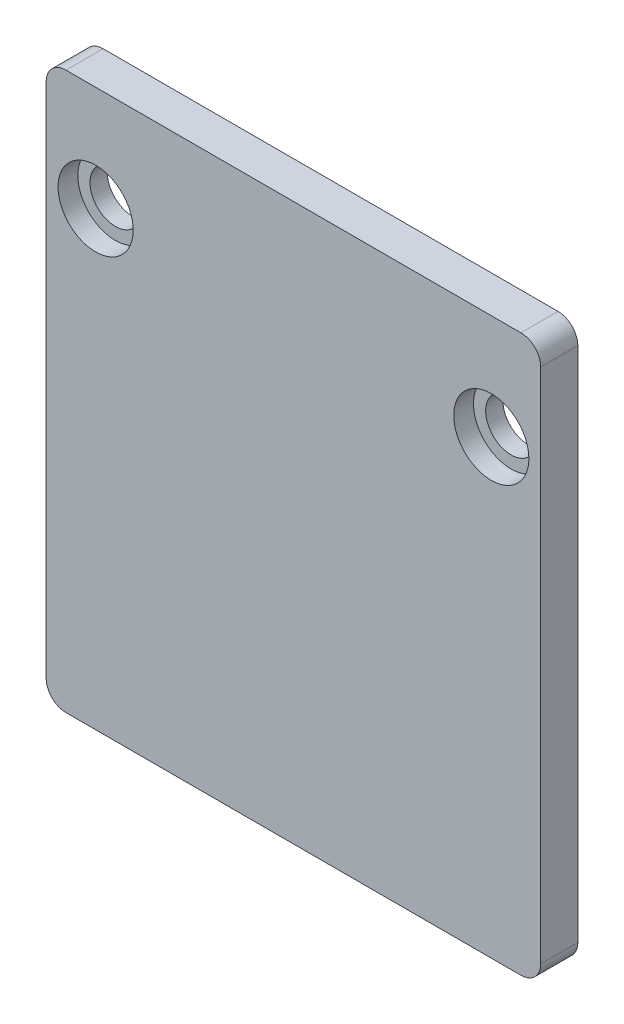
ISO-10303-21;
HEADER;
FILE_DESCRIPTION(('STEP AP214'),'2;1');
FILE_NAME('part.step','',(''),(''),'','','');
FILE_SCHEMA(('AUTOMOTIVE_DESIGN { 1 0 10303 214 1 1 1 1 }'));
ENDSEC;
DATA;
#1=APPLICATION_CONTEXT('core data for automotive mechanical design processes');
#2=APPLICATION_PROTOCOL_DEFINITION('international standard','automotive_design',2000,#1);
#3=PRODUCT_CONTEXT('',#1,'mechanical');
#4=PRODUCT('Part','Part','',(#3));
#5=PRODUCT_RELATED_PRODUCT_CATEGORY('part','',(#4));
#6=PRODUCT_DEFINITION_FORMATION('','',#4);
#7=PRODUCT_DEFINITION_CONTEXT('part definition',#1,'design');
#8=PRODUCT_DEFINITION('design','',#6,#7);
#9=PRODUCT_DEFINITION_SHAPE('','',#8);
#10=(LENGTH_UNIT() NAMED_UNIT(*) SI_UNIT(.MILLI.,.METRE.));
#11=(NAMED_UNIT(*) PLANE_ANGLE_UNIT() SI_UNIT($,.RADIAN.));
#12=(NAMED_UNIT(*) SI_UNIT($,.STERADIAN.) SOLID_ANGLE_UNIT());
#13=UNCERTAINTY_MEASURE_WITH_UNIT(LENGTH_MEASURE(1.E-05),#10,'distance_accuracy_value','');
#14=(GEOMETRIC_REPRESENTATION_CONTEXT(3) GLOBAL_UNCERTAINTY_ASSIGNED_CONTEXT((#13)) GLOBAL_UNIT_ASSIGNED_CONTEXT((#10,
#11,#12)) REPRESENTATION_CONTEXT('',''));
#15=CARTESIAN_POINT('',(0.,0.,0.));
#16=DIRECTION('',(0.,0.,1.));
#17=DIRECTION('',(1.,0.,0.));
#18=AXIS2_PLACEMENT_3D('',#15,#16,#17);
#19=CARTESIAN_POINT('',(0.,0.,4.7625));
#20=DIRECTION('',(0.,0.,-1.));
#21=DIRECTION('',(-1.,0.,0.));
#22=AXIS2_PLACEMENT_3D('',#19,#20,#21);
#23=PLANE('',#22);
#24=CARTESIAN_POINT('',(57.15,57.9501,4.7625));
#25=DIRECTION('',(0.,0.,1.));
#26=DIRECTION('',(1.,0.,0.));
#27=AXIS2_PLACEMENT_3D('',#24,#25,#26);
#28=CIRCLE('',#27,4.826);
#29=CARTESIAN_POINT('',(61.976,57.9501,4.7625));
#30=VERTEX_POINT('',#29);
#31=EDGE_CURVE('E186',#30,#30,#28,.T.);
#32=ORIENTED_EDGE('',*,*,#31,.F.);
#33=EDGE_LOOP('',(#32));
#34=FACE_BOUND('',#33,.T.);
#35=DIRECTION('',(0.,-1.,0.));
#36=VECTOR('',#35,1.);
#37=CARTESIAN_POINT('',(0.,0.,4.7625));
#38=LINE('',#37,#36);
#39=CARTESIAN_POINT('',(0.,68.8975,4.7625));
#40=VERTEX_POINT('',#39);
#41=CARTESIAN_POINT('',(0.,2.54,4.7625));
#42=VERTEX_POINT('',#41);
#43=EDGE_CURVE('E138',#40,#42,#38,.T.);
#44=ORIENTED_EDGE('',*,*,#43,.T.);
#45=CARTESIAN_POINT('',(2.54,2.54,4.7625));
#46=DIRECTION('',(0.,0.,-1.));
#47=DIRECTION('',(-1.,0.,0.));
#48=AXIS2_PLACEMENT_3D('',#45,#46,#47);
#49=CIRCLE('',#48,2.54);
#50=CARTESIAN_POINT('',(2.54,0.,4.7625));
#51=VERTEX_POINT('',#50);
#52=EDGE_CURVE('E153',#42,#51,#49,.F.);
#53=ORIENTED_EDGE('',*,*,#52,.T.);
#54=DIRECTION('',(1.,0.,0.));
#55=VECTOR('',#54,1.);
#56=CARTESIAN_POINT('',(0.,0.,4.7625));
#57=LINE('',#56,#55);
#58=CARTESIAN_POINT('',(60.96,0.,4.7625));
#59=VERTEX_POINT('',#58);
#60=EDGE_CURVE('E121',#51,#59,#57,.T.);
#61=ORIENTED_EDGE('',*,*,#60,.T.);
#62=CARTESIAN_POINT('',(60.96,2.54,4.7625));
#63=DIRECTION('',(0.,0.,-1.));
#64=DIRECTION('',(-1.,0.,0.));
#65=AXIS2_PLACEMENT_3D('',#62,#63,#64);
#66=CIRCLE('',#65,2.54);
#67=CARTESIAN_POINT('',(63.5,2.54,4.7625));
#68=VERTEX_POINT('',#67);
#69=EDGE_CURVE('E151',#59,#68,#66,.F.);
#70=ORIENTED_EDGE('',*,*,#69,.T.);
#71=DIRECTION('',(0.,1.,0.));
#72=VECTOR('',#71,1.);
#73=CARTESIAN_POINT('',(63.5,0.,4.7625));
#74=LINE('',#73,#72);
#75=CARTESIAN_POINT('',(63.5,68.8975,4.7625));
#76=VERTEX_POINT('',#75);
#77=EDGE_CURVE('E164',#68,#76,#74,.T.);
#78=ORIENTED_EDGE('',*,*,#77,.T.);
#79=CARTESIAN_POINT('',(60.96,68.8975,4.7625));
#80=DIRECTION('',(0.,0.,-1.));
#81=DIRECTION('',(-1.,0.,0.));
#82=AXIS2_PLACEMENT_3D('',#79,#80,#81);
#83=CIRCLE('',#82,2.54);
#84=CARTESIAN_POINT('',(60.96,71.4375,4.7625));
#85=VERTEX_POINT('',#84);
#86=EDGE_CURVE('E56',#76,#85,#83,.F.);
#87=ORIENTED_EDGE('',*,*,#86,.T.);
#88=DIRECTION('',(-1.,0.,0.));
#89=VECTOR('',#88,1.);
#90=CARTESIAN_POINT('',(0.,71.4375,4.7625));
#91=LINE('',#90,#89);
#92=CARTESIAN_POINT('',(2.54,71.4375,4.7625));
#93=VERTEX_POINT('',#92);
#94=EDGE_CURVE('E139',#85,#93,#91,.T.);
#95=ORIENTED_EDGE('',*,*,#94,.T.);
#96=CARTESIAN_POINT('',(2.54,68.8975,4.7625));
#97=DIRECTION('',(0.,0.,-1.));
#98=DIRECTION('',(-1.,0.,0.));
#99=AXIS2_PLACEMENT_3D('',#96,#97,#98);
#100=CIRCLE('',#99,2.54);
#101=EDGE_CURVE('E148',#93,#40,#100,.F.);
#102=ORIENTED_EDGE('',*,*,#101,.T.);
#103=EDGE_LOOP('',(#44,#53,#61,#70,#78,#87,#95,#102));
#104=FACE_BOUND('',#103,.T.);
#105=CARTESIAN_POINT('',(6.35,57.9501,4.7625));
#106=DIRECTION('',(0.,0.,1.));
#107=DIRECTION('',(1.,0.,0.));
#108=AXIS2_PLACEMENT_3D('',#105,#106,#107);
#109=CIRCLE('',#108,4.826);
#110=CARTESIAN_POINT('',(11.176,57.9501,4.7625));
#111=VERTEX_POINT('',#110);
#112=EDGE_CURVE('E198',#111,#111,#109,.T.);
#113=ORIENTED_EDGE('',*,*,#112,.F.);
#114=EDGE_LOOP('',(#113));
#115=FACE_BOUND('',#114,.T.);
#116=ADVANCED_FACE('F35',(#34,#104,#115),#23,.F.);
#117=CARTESIAN_POINT('',(0.,0.,4.7625));
#118=DIRECTION('',(1.,0.,0.));
#119=DIRECTION('',(0.,0.,-1.));
#120=AXIS2_PLACEMENT_3D('',#117,#118,#119);
#121=PLANE('',#120);
#122=DIRECTION('',(0.,-1.,0.));
#123=VECTOR('',#122,1.);
#124=CARTESIAN_POINT('',(0.,0.,0.));
#125=LINE('',#124,#123);
#126=CARTESIAN_POINT('',(0.,68.8975,0.));
#127=VERTEX_POINT('',#126);
#128=CARTESIAN_POINT('',(0.,2.54,0.));
#129=VERTEX_POINT('',#128);
#130=EDGE_CURVE('E128',#127,#129,#125,.T.);
#131=ORIENTED_EDGE('',*,*,#130,.T.);
#132=DIRECTION('',(0.,0.,-1.));
#133=VECTOR('',#132,1.);
#134=CARTESIAN_POINT('',(0.,2.54,4.7625));
#135=LINE('',#134,#133);
#136=EDGE_CURVE('E106',#129,#42,#135,.F.);
#137=ORIENTED_EDGE('',*,*,#136,.T.);
#138=ORIENTED_EDGE('',*,*,#43,.F.);
#139=DIRECTION('',(0.,0.,-1.));
#140=VECTOR('',#139,1.);
#141=CARTESIAN_POINT('',(0.,68.8975,4.7625));
#142=LINE('',#141,#140);
#143=EDGE_CURVE('E111',#40,#127,#142,.T.);
#144=ORIENTED_EDGE('',*,*,#143,.T.);
#145=EDGE_LOOP('',(#131,#137,#138,#144));
#146=FACE_BOUND('',#145,.T.);
#147=ADVANCED_FACE('F205',(#146),#121,.F.);
#148=CARTESIAN_POINT('',(0.,0.,4.7625));
#149=DIRECTION('',(0.,1.,0.));
#150=DIRECTION('',(0.,0.,1.));
#151=AXIS2_PLACEMENT_3D('',#148,#149,#150);
#152=PLANE('',#151);
#153=ORIENTED_EDGE('',*,*,#60,.F.);
#154=DIRECTION('',(0.,0.,-1.));
#155=VECTOR('',#154,1.);
#156=CARTESIAN_POINT('',(2.54,0.,4.7625));
#157=LINE('',#156,#155);
#158=CARTESIAN_POINT('',(2.54,0.,0.));
#159=VERTEX_POINT('',#158);
#160=EDGE_CURVE('E105',#51,#159,#157,.T.);
#161=ORIENTED_EDGE('',*,*,#160,.T.);
#162=DIRECTION('',(1.,0.,0.));
#163=VECTOR('',#162,1.);
#164=CARTESIAN_POINT('',(0.,0.,0.));
#165=LINE('',#164,#163);
#166=CARTESIAN_POINT('',(60.96,0.,0.));
#167=VERTEX_POINT('',#166);
#168=EDGE_CURVE('E118',#159,#167,#165,.T.);
#169=ORIENTED_EDGE('',*,*,#168,.T.);
#170=DIRECTION('',(0.,0.,-1.));
#171=VECTOR('',#170,1.);
#172=CARTESIAN_POINT('',(60.96,0.,4.7625));
#173=LINE('',#172,#171);
#174=EDGE_CURVE('E123',#167,#59,#173,.F.);
#175=ORIENTED_EDGE('',*,*,#174,.T.);
#176=EDGE_LOOP('',(#153,#161,#169,#175));
#177=FACE_BOUND('',#176,.T.);
#178=ADVANCED_FACE('F117',(#177),#152,.F.);
#179=CARTESIAN_POINT('',(63.5,0.,4.7625));
#180=DIRECTION('',(-1.,0.,0.));
#181=DIRECTION('',(0.,0.,1.));
#182=AXIS2_PLACEMENT_3D('',#179,#180,#181);
#183=PLANE('',#182);
#184=ORIENTED_EDGE('',*,*,#77,.F.);
#185=DIRECTION('',(0.,0.,-1.));
#186=VECTOR('',#185,1.);
#187=CARTESIAN_POINT('',(63.5,2.54,4.7625));
#188=LINE('',#187,#186);
#189=CARTESIAN_POINT('',(63.5,2.54,0.));
#190=VERTEX_POINT('',#189);
#191=EDGE_CURVE('E157',#68,#190,#188,.T.);
#192=ORIENTED_EDGE('',*,*,#191,.T.);
#193=DIRECTION('',(0.,1.,0.));
#194=VECTOR('',#193,1.);
#195=CARTESIAN_POINT('',(63.5,0.,0.));
#196=LINE('',#195,#194);
#197=CARTESIAN_POINT('',(63.5,68.8975,0.));
#198=VERTEX_POINT('',#197);
#199=EDGE_CURVE('E127',#190,#198,#196,.T.);
#200=ORIENTED_EDGE('',*,*,#199,.T.);
#201=DIRECTION('',(0.,0.,-1.));
#202=VECTOR('',#201,1.);
#203=CARTESIAN_POINT('',(63.5,68.8975,4.7625));
#204=LINE('',#203,#202);
#205=EDGE_CURVE('E155',#198,#76,#204,.F.);
#206=ORIENTED_EDGE('',*,*,#205,.T.);
#207=EDGE_LOOP('',(#184,#192,#200,#206));
#208=FACE_BOUND('',#207,.T.);
#209=ADVANCED_FACE('F162',(#208),#183,.F.);
#210=CARTESIAN_POINT('',(0.,71.4375,4.7625));
#211=DIRECTION('',(0.,-1.,0.));
#212=DIRECTION('',(0.,0.,-1.));
#213=AXIS2_PLACEMENT_3D('',#210,#211,#212);
#214=PLANE('',#213);
#215=ORIENTED_EDGE('',*,*,#94,.F.);
#216=DIRECTION('',(0.,0.,-1.));
#217=VECTOR('',#216,1.);
#218=CARTESIAN_POINT('',(60.96,71.4375,4.7625));
#219=LINE('',#218,#217);
#220=CARTESIAN_POINT('',(60.96,71.4375,0.));
#221=VERTEX_POINT('',#220);
#222=EDGE_CURVE('E11',#85,#221,#219,.T.);
#223=ORIENTED_EDGE('',*,*,#222,.T.);
#224=DIRECTION('',(-1.,0.,0.));
#225=VECTOR('',#224,1.);
#226=CARTESIAN_POINT('',(0.,71.4375,0.));
#227=LINE('',#226,#225);
#228=CARTESIAN_POINT('',(2.54,71.4375,0.));
#229=VERTEX_POINT('',#228);
#230=EDGE_CURVE('E131',#221,#229,#227,.T.);
#231=ORIENTED_EDGE('',*,*,#230,.T.);
#232=DIRECTION('',(0.,0.,-1.));
#233=VECTOR('',#232,1.);
#234=CARTESIAN_POINT('',(2.54,71.4375,4.7625));
#235=LINE('',#234,#233);
#236=EDGE_CURVE('E43',#229,#93,#235,.F.);
#237=ORIENTED_EDGE('',*,*,#236,.T.);
#238=EDGE_LOOP('',(#215,#223,#231,#237));
#239=FACE_BOUND('',#238,.T.);
#240=ADVANCED_FACE('F171',(#239),#214,.F.);
#241=CARTESIAN_POINT('',(0.,0.,0.));
#242=DIRECTION('',(0.,0.,-1.));
#243=DIRECTION('',(-1.,0.,0.));
#244=AXIS2_PLACEMENT_3D('',#241,#242,#243);
#245=PLANE('',#244);
#246=CARTESIAN_POINT('',(6.35,57.9501,0.));
#247=DIRECTION('',(0.,0.,1.));
#248=DIRECTION('',(1.,0.,0.));
#249=AXIS2_PLACEMENT_3D('',#246,#247,#248);
#250=CIRCLE('',#249,3.2639);
#251=CARTESIAN_POINT('',(9.6139,57.9501,0.));
#252=VERTEX_POINT('',#251);
#253=EDGE_CURVE('E189',#252,#252,#250,.T.);
#254=ORIENTED_EDGE('',*,*,#253,.T.);
#255=EDGE_LOOP('',(#254));
#256=FACE_BOUND('',#255,.T.);
#257=CARTESIAN_POINT('',(57.15,57.9501,0.));
#258=DIRECTION('',(0.,0.,1.));
#259=DIRECTION('',(1.,0.,0.));
#260=AXIS2_PLACEMENT_3D('',#257,#258,#259);
#261=CIRCLE('',#260,3.2639);
#262=CARTESIAN_POINT('',(60.4139,57.9501,0.));
#263=VERTEX_POINT('',#262);
#264=EDGE_CURVE('E133',#263,#263,#261,.T.);
#265=ORIENTED_EDGE('',*,*,#264,.T.);
#266=EDGE_LOOP('',(#265));
#267=FACE_BOUND('',#266,.T.);
#268=ORIENTED_EDGE('',*,*,#168,.F.);
#269=CARTESIAN_POINT('',(2.54,2.54,0.));
#270=DIRECTION('',(0.,0.,-1.));
#271=DIRECTION('',(-1.,0.,0.));
#272=AXIS2_PLACEMENT_3D('',#269,#270,#271);
#273=CIRCLE('',#272,2.54);
#274=EDGE_CURVE('E101',#159,#129,#273,.T.);
#275=ORIENTED_EDGE('',*,*,#274,.T.);
#276=ORIENTED_EDGE('',*,*,#130,.F.);
#277=CARTESIAN_POINT('',(2.54,68.8975,0.));
#278=DIRECTION('',(0.,0.,-1.));
#279=DIRECTION('',(-1.,0.,0.));
#280=AXIS2_PLACEMENT_3D('',#277,#278,#279);
#281=CIRCLE('',#280,2.54);
#282=EDGE_CURVE('E122',#127,#229,#281,.T.);
#283=ORIENTED_EDGE('',*,*,#282,.T.);
#284=ORIENTED_EDGE('',*,*,#230,.F.);
#285=CARTESIAN_POINT('',(60.96,68.8975,0.));
#286=DIRECTION('',(0.,0.,-1.));
#287=DIRECTION('',(-1.,0.,0.));
#288=AXIS2_PLACEMENT_3D('',#285,#286,#287);
#289=CIRCLE('',#288,2.54);
#290=EDGE_CURVE('E142',#221,#198,#289,.T.);
#291=ORIENTED_EDGE('',*,*,#290,.T.);
#292=ORIENTED_EDGE('',*,*,#199,.F.);
#293=CARTESIAN_POINT('',(60.96,2.54,0.));
#294=DIRECTION('',(0.,0.,-1.));
#295=DIRECTION('',(-1.,0.,0.));
#296=AXIS2_PLACEMENT_3D('',#293,#294,#295);
#297=CIRCLE('',#296,2.54);
#298=EDGE_CURVE('E112',#190,#167,#297,.T.);
#299=ORIENTED_EDGE('',*,*,#298,.T.);
#300=EDGE_LOOP('',(#268,#275,#276,#283,#284,#291,#292,#299));
#301=FACE_BOUND('',#300,.T.);
#302=ADVANCED_FACE('F125',(#256,#267,#301),#245,.T.);
#303=CARTESIAN_POINT('',(57.15,57.9501,4.7625));
#304=DIRECTION('',(0.,0.,1.));
#305=DIRECTION('',(1.,0.,0.));
#306=AXIS2_PLACEMENT_3D('',#303,#304,#305);
#307=CYLINDRICAL_SURFACE('',#306,3.2639);
#308=ORIENTED_EDGE('',*,*,#264,.F.);
#309=EDGE_LOOP('',(#308));
#310=FACE_BOUND('',#309,.T.);
#311=CARTESIAN_POINT('',(57.15,57.9501,2.2225));
#312=DIRECTION('',(0.,0.,1.));
#313=DIRECTION('',(1.,0.,0.));
#314=AXIS2_PLACEMENT_3D('',#311,#312,#313);
#315=CIRCLE('',#314,3.2639);
#316=CARTESIAN_POINT('',(60.4139,57.9501,2.2225));
#317=VERTEX_POINT('',#316);
#318=EDGE_CURVE('E180',#317,#317,#315,.T.);
#319=ORIENTED_EDGE('',*,*,#318,.T.);
#320=EDGE_LOOP('',(#319));
#321=FACE_BOUND('',#320,.T.);
#322=ADVANCED_FACE('F217',(#310,#321),#307,.F.);
#323=CARTESIAN_POINT('',(60.4139,57.9501,2.2225));
#324=DIRECTION('',(0.,0.,-1.));
#325=DIRECTION('',(-1.,0.,0.));
#326=AXIS2_PLACEMENT_3D('',#323,#324,#325);
#327=PLANE('',#326);
#328=ORIENTED_EDGE('',*,*,#318,.F.);
#329=EDGE_LOOP('',(#328));
#330=FACE_BOUND('',#329,.T.);
#331=CARTESIAN_POINT('',(57.15,57.9501,2.2225));
#332=DIRECTION('',(0.,0.,1.));
#333=DIRECTION('',(1.,0.,0.));
#334=AXIS2_PLACEMENT_3D('',#331,#332,#333);
#335=CIRCLE('',#334,4.826);
#336=CARTESIAN_POINT('',(61.976,57.9501,2.2225));
#337=VERTEX_POINT('',#336);
#338=EDGE_CURVE('E183',#337,#337,#335,.T.);
#339=ORIENTED_EDGE('',*,*,#338,.T.);
#340=EDGE_LOOP('',(#339));
#341=FACE_BOUND('',#340,.T.);
#342=ADVANCED_FACE('F292',(#330,#341),#327,.F.);
#343=CARTESIAN_POINT('',(57.15,57.9501,4.7625));
#344=DIRECTION('',(0.,0.,1.));
#345=DIRECTION('',(1.,0.,0.));
#346=AXIS2_PLACEMENT_3D('',#343,#344,#345);
#347=CYLINDRICAL_SURFACE('',#346,4.826);
#348=ORIENTED_EDGE('',*,*,#338,.F.);
#349=EDGE_LOOP('',(#348));
#350=FACE_BOUND('',#349,.T.);
#351=ORIENTED_EDGE('',*,*,#31,.T.);
#352=EDGE_LOOP('',(#351));
#353=FACE_BOUND('',#352,.T.);
#354=ADVANCED_FACE('F284',(#350,#353),#347,.F.);
#355=CARTESIAN_POINT('',(6.35,57.9501,4.7625));
#356=DIRECTION('',(0.,0.,1.));
#357=DIRECTION('',(1.,0.,0.));
#358=AXIS2_PLACEMENT_3D('',#355,#356,#357);
#359=CYLINDRICAL_SURFACE('',#358,3.2639);
#360=ORIENTED_EDGE('',*,*,#253,.F.);
#361=EDGE_LOOP('',(#360));
#362=FACE_BOUND('',#361,.T.);
#363=CARTESIAN_POINT('',(6.35,57.9501,2.2225));
#364=DIRECTION('',(0.,0.,1.));
#365=DIRECTION('',(1.,0.,0.));
#366=AXIS2_PLACEMENT_3D('',#363,#364,#365);
#367=CIRCLE('',#366,3.2639);
#368=CARTESIAN_POINT('',(9.6139,57.9501,2.2225));
#369=VERTEX_POINT('',#368);
#370=EDGE_CURVE('E192',#369,#369,#367,.T.);
#371=ORIENTED_EDGE('',*,*,#370,.T.);
#372=EDGE_LOOP('',(#371));
#373=FACE_BOUND('',#372,.T.);
#374=ADVANCED_FACE('F276',(#362,#373),#359,.F.);
#375=CARTESIAN_POINT('',(9.6139,57.9501,2.2225));
#376=DIRECTION('',(0.,0.,-1.));
#377=DIRECTION('',(-1.,0.,0.));
#378=AXIS2_PLACEMENT_3D('',#375,#376,#377);
#379=PLANE('',#378);
#380=ORIENTED_EDGE('',*,*,#370,.F.);
#381=EDGE_LOOP('',(#380));
#382=FACE_BOUND('',#381,.T.);
#383=CARTESIAN_POINT('',(6.35,57.9501,2.2225));
#384=DIRECTION('',(0.,0.,1.));
#385=DIRECTION('',(1.,0.,0.));
#386=AXIS2_PLACEMENT_3D('',#383,#384,#385);
#387=CIRCLE('',#386,4.826);
#388=CARTESIAN_POINT('',(11.176,57.9501,2.2225));
#389=VERTEX_POINT('',#388);
#390=EDGE_CURVE('E195',#389,#389,#387,.T.);
#391=ORIENTED_EDGE('',*,*,#390,.T.);
#392=EDGE_LOOP('',(#391));
#393=FACE_BOUND('',#392,.T.);
#394=ADVANCED_FACE('F268',(#382,#393),#379,.F.);
#395=CARTESIAN_POINT('',(6.35,57.9501,4.7625));
#396=DIRECTION('',(0.,0.,1.));
#397=DIRECTION('',(1.,0.,0.));
#398=AXIS2_PLACEMENT_3D('',#395,#396,#397);
#399=CYLINDRICAL_SURFACE('',#398,4.826);
#400=ORIENTED_EDGE('',*,*,#390,.F.);
#401=EDGE_LOOP('',(#400));
#402=FACE_BOUND('',#401,.T.);
#403=ORIENTED_EDGE('',*,*,#112,.T.);
#404=EDGE_LOOP('',(#403));
#405=FACE_BOUND('',#404,.T.);
#406=ADVANCED_FACE('F202',(#402,#405),#399,.F.);
#407=CARTESIAN_POINT('',(2.54,2.54,4.7625));
#408=DIRECTION('',(0.,0.,-1.));
#409=DIRECTION('',(-1.,0.,0.));
#410=AXIS2_PLACEMENT_3D('',#407,#408,#409);
#411=CYLINDRICAL_SURFACE('',#410,2.54);
#412=ORIENTED_EDGE('',*,*,#52,.F.);
#413=ORIENTED_EDGE('',*,*,#136,.F.);
#414=ORIENTED_EDGE('',*,*,#274,.F.);
#415=ORIENTED_EDGE('',*,*,#160,.F.);
#416=EDGE_LOOP('',(#412,#413,#414,#415));
#417=FACE_BOUND('',#416,.T.);
#418=ADVANCED_FACE('F104',(#417),#411,.T.);
#419=CARTESIAN_POINT('',(60.96,2.54,4.7625));
#420=DIRECTION('',(0.,0.,-1.));
#421=DIRECTION('',(-1.,0.,0.));
#422=AXIS2_PLACEMENT_3D('',#419,#420,#421);
#423=CYLINDRICAL_SURFACE('',#422,2.54);
#424=ORIENTED_EDGE('',*,*,#69,.F.);
#425=ORIENTED_EDGE('',*,*,#174,.F.);
#426=ORIENTED_EDGE('',*,*,#298,.F.);
#427=ORIENTED_EDGE('',*,*,#191,.F.);
#428=EDGE_LOOP('',(#424,#425,#426,#427));
#429=FACE_BOUND('',#428,.T.);
#430=ADVANCED_FACE('F230',(#429),#423,.T.);
#431=CARTESIAN_POINT('',(60.96,68.8975,4.7625));
#432=DIRECTION('',(0.,0.,-1.));
#433=DIRECTION('',(-1.,0.,0.));
#434=AXIS2_PLACEMENT_3D('',#431,#432,#433);
#435=CYLINDRICAL_SURFACE('',#434,2.54);
#436=ORIENTED_EDGE('',*,*,#86,.F.);
#437=ORIENTED_EDGE('',*,*,#205,.F.);
#438=ORIENTED_EDGE('',*,*,#290,.F.);
#439=ORIENTED_EDGE('',*,*,#222,.F.);
#440=EDGE_LOOP('',(#436,#437,#438,#439));
#441=FACE_BOUND('',#440,.T.);
#442=ADVANCED_FACE('F170',(#441),#435,.T.);
#443=CARTESIAN_POINT('',(2.54,68.8975,4.7625));
#444=DIRECTION('',(0.,0.,-1.));
#445=DIRECTION('',(-1.,0.,0.));
#446=AXIS2_PLACEMENT_3D('',#443,#444,#445);
#447=CYLINDRICAL_SURFACE('',#446,2.54);
#448=ORIENTED_EDGE('',*,*,#101,.F.);
#449=ORIENTED_EDGE('',*,*,#236,.F.);
#450=ORIENTED_EDGE('',*,*,#282,.F.);
#451=ORIENTED_EDGE('',*,*,#143,.F.);
#452=EDGE_LOOP('',(#448,#449,#450,#451));
#453=FACE_BOUND('',#452,.T.);
#454=ADVANCED_FACE('F37',(#453),#447,.T.);
#455=CLOSED_SHELL('',(#116,#147,#178,#209,#240,#302,#322,#342,#354,#374,#394,#406,#418,#430,
#442,#454));
#456=MANIFOLD_SOLID_BREP('B2',#455);
#457=ADVANCED_BREP_SHAPE_REPRESENTATION('',(#18,#456),#14);
#458=SHAPE_DEFINITION_REPRESENTATION(#9,#457);
ENDSEC;
END-ISO-10303-21;
